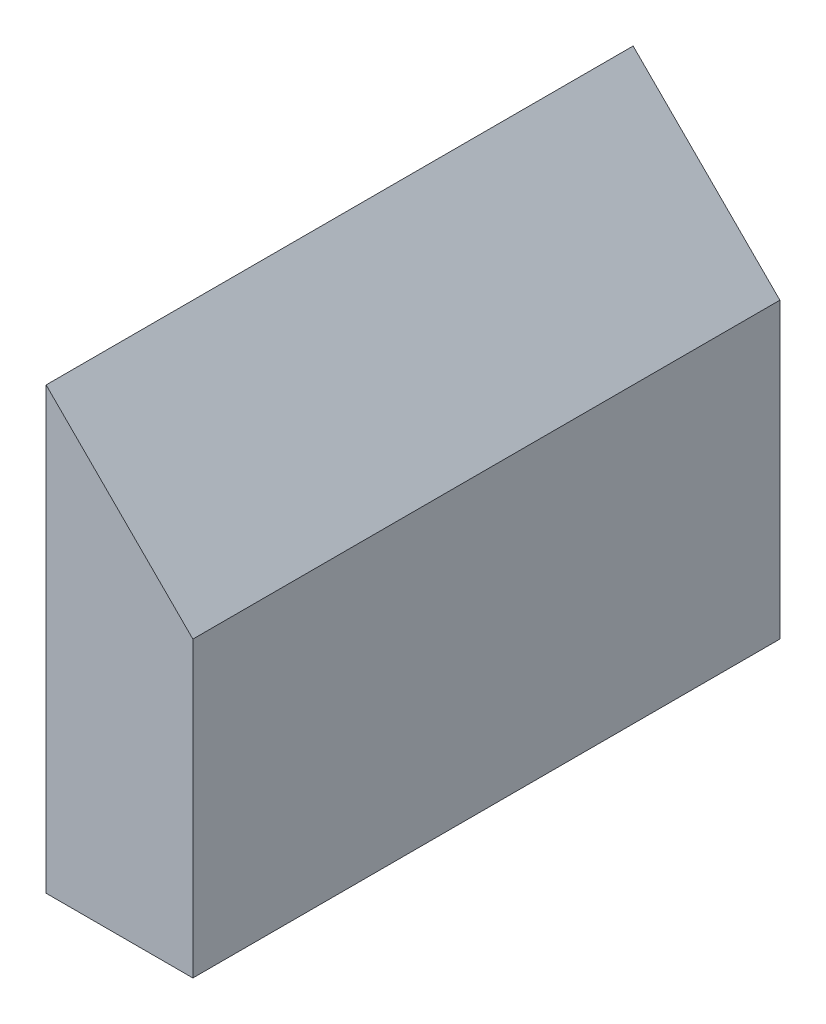
ISO-10303-21;
HEADER;
FILE_DESCRIPTION(('STEP AP214'),'2;1');
FILE_NAME('part.step','',(''),(''),'','','');
FILE_SCHEMA(('AUTOMOTIVE_DESIGN { 1 0 10303 214 1 1 1 1 }'));
ENDSEC;
DATA;
#1=APPLICATION_CONTEXT('core data for automotive mechanical design processes');
#2=APPLICATION_PROTOCOL_DEFINITION('international standard','automotive_design',2000,#1);
#3=PRODUCT_CONTEXT('',#1,'mechanical');
#4=PRODUCT('Part','Part','',(#3));
#5=PRODUCT_RELATED_PRODUCT_CATEGORY('part','',(#4));
#6=PRODUCT_DEFINITION_FORMATION('','',#4);
#7=PRODUCT_DEFINITION_CONTEXT('part definition',#1,'design');
#8=PRODUCT_DEFINITION('design','',#6,#7);
#9=PRODUCT_DEFINITION_SHAPE('','',#8);
#10=(LENGTH_UNIT() NAMED_UNIT(*) SI_UNIT(.MILLI.,.METRE.));
#11=(NAMED_UNIT(*) PLANE_ANGLE_UNIT() SI_UNIT($,.RADIAN.));
#12=(NAMED_UNIT(*) SI_UNIT($,.STERADIAN.) SOLID_ANGLE_UNIT());
#13=UNCERTAINTY_MEASURE_WITH_UNIT(LENGTH_MEASURE(1.E-05),#10,'distance_accuracy_value','');
#14=(GEOMETRIC_REPRESENTATION_CONTEXT(3) GLOBAL_UNCERTAINTY_ASSIGNED_CONTEXT((#13)) GLOBAL_UNIT_ASSIGNED_CONTEXT((#10,
#11,#12)) REPRESENTATION_CONTEXT('',''));
#15=CARTESIAN_POINT('',(0.,0.,0.));
#16=DIRECTION('',(0.,0.,1.));
#17=DIRECTION('',(1.,0.,0.));
#18=AXIS2_PLACEMENT_3D('',#15,#16,#17);
#19=CARTESIAN_POINT('',(0.,0.,40.));
#20=DIRECTION('',(-1.,0.,0.));
#21=DIRECTION('',(0.,0.,1.));
#22=AXIS2_PLACEMENT_3D('',#19,#20,#21);
#23=PLANE('',#22);
#24=DIRECTION('',(0.,1.,0.));
#25=VECTOR('',#24,1.);
#26=CARTESIAN_POINT('',(0.,0.,0.));
#27=LINE('',#26,#25);
#28=CARTESIAN_POINT('',(0.,0.,0.));
#29=VERTEX_POINT('',#28);
#30=CARTESIAN_POINT('',(0.,30.,0.));
#31=VERTEX_POINT('',#30);
#32=EDGE_CURVE('E104',#29,#31,#27,.T.);
#33=ORIENTED_EDGE('',*,*,#32,.F.);
#34=DIRECTION('',(0.,0.,-1.));
#35=VECTOR('',#34,1.);
#36=CARTESIAN_POINT('',(0.,0.,40.));
#37=LINE('',#36,#35);
#38=CARTESIAN_POINT('',(0.,0.,40.));
#39=VERTEX_POINT('',#38);
#40=EDGE_CURVE('E11',#39,#29,#37,.T.);
#41=ORIENTED_EDGE('',*,*,#40,.F.);
#42=DIRECTION('',(0.,1.,0.));
#43=VECTOR('',#42,1.);
#44=CARTESIAN_POINT('',(0.,0.,40.));
#45=LINE('',#44,#43);
#46=CARTESIAN_POINT('',(0.,30.,40.));
#47=VERTEX_POINT('',#46);
#48=EDGE_CURVE('E100',#39,#47,#45,.T.);
#49=ORIENTED_EDGE('',*,*,#48,.T.);
#50=DIRECTION('',(0.,0.,-1.));
#51=VECTOR('',#50,1.);
#52=CARTESIAN_POINT('',(0.,30.,40.));
#53=LINE('',#52,#51);
#54=EDGE_CURVE('E45',#47,#31,#53,.T.);
#55=ORIENTED_EDGE('',*,*,#54,.T.);
#56=EDGE_LOOP('',(#33,#41,#49,#55));
#57=FACE_BOUND('',#56,.T.);
#58=ADVANCED_FACE('F39',(#57),#23,.T.);
#59=CARTESIAN_POINT('',(10.,0.,40.));
#60=DIRECTION('',(0.,-1.,0.));
#61=DIRECTION('',(1.,0.,0.));
#62=AXIS2_PLACEMENT_3D('',#59,#60,#61);
#63=PLANE('',#62);
#64=DIRECTION('',(-1.,0.,0.));
#65=VECTOR('',#64,1.);
#66=CARTESIAN_POINT('',(10.,0.,0.));
#67=LINE('',#66,#65);
#68=CARTESIAN_POINT('',(10.,0.,0.));
#69=VERTEX_POINT('',#68);
#70=EDGE_CURVE('E98',#69,#29,#67,.T.);
#71=ORIENTED_EDGE('',*,*,#70,.F.);
#72=DIRECTION('',(0.,0.,-1.));
#73=VECTOR('',#72,1.);
#74=CARTESIAN_POINT('',(10.,0.,40.));
#75=LINE('',#74,#73);
#76=CARTESIAN_POINT('',(10.,0.,40.));
#77=VERTEX_POINT('',#76);
#78=EDGE_CURVE('E48',#77,#69,#75,.T.);
#79=ORIENTED_EDGE('',*,*,#78,.F.);
#80=DIRECTION('',(-1.,0.,0.));
#81=VECTOR('',#80,1.);
#82=CARTESIAN_POINT('',(10.,0.,40.));
#83=LINE('',#82,#81);
#84=EDGE_CURVE('E92',#77,#39,#83,.T.);
#85=ORIENTED_EDGE('',*,*,#84,.T.);
#86=ORIENTED_EDGE('',*,*,#40,.T.);
#87=EDGE_LOOP('',(#71,#79,#85,#86));
#88=FACE_BOUND('',#87,.T.);
#89=ADVANCED_FACE('F111',(#88),#63,.T.);
#90=CARTESIAN_POINT('',(10.,20.,40.));
#91=DIRECTION('',(1.,0.,0.));
#92=DIRECTION('',(0.,1.,0.));
#93=AXIS2_PLACEMENT_3D('',#90,#91,#92);
#94=PLANE('',#93);
#95=DIRECTION('',(0.,-1.,0.));
#96=VECTOR('',#95,1.);
#97=CARTESIAN_POINT('',(10.,20.,0.));
#98=LINE('',#97,#96);
#99=CARTESIAN_POINT('',(10.,20.,0.));
#100=VERTEX_POINT('',#99);
#101=EDGE_CURVE('E87',#100,#69,#98,.T.);
#102=ORIENTED_EDGE('',*,*,#101,.F.);
#103=DIRECTION('',(0.,0.,-1.));
#104=VECTOR('',#103,1.);
#105=CARTESIAN_POINT('',(10.,20.,40.));
#106=LINE('',#105,#104);
#107=CARTESIAN_POINT('',(10.,20.,40.));
#108=VERTEX_POINT('',#107);
#109=EDGE_CURVE('E84',#108,#100,#106,.T.);
#110=ORIENTED_EDGE('',*,*,#109,.F.);
#111=DIRECTION('',(0.,-1.,0.));
#112=VECTOR('',#111,1.);
#113=CARTESIAN_POINT('',(10.,20.,40.));
#114=LINE('',#113,#112);
#115=EDGE_CURVE('E90',#108,#77,#114,.T.);
#116=ORIENTED_EDGE('',*,*,#115,.T.);
#117=ORIENTED_EDGE('',*,*,#78,.T.);
#118=EDGE_LOOP('',(#102,#110,#116,#117));
#119=FACE_BOUND('',#118,.T.);
#120=ADVANCED_FACE('F86',(#119),#94,.T.);
#121=CARTESIAN_POINT('',(0.,30.,40.));
#122=DIRECTION('',(0.707106781186547,0.707106781186548,0.));
#123=DIRECTION('',(-0.707106781186548,0.707106781186547,0.));
#124=AXIS2_PLACEMENT_3D('',#121,#122,#123);
#125=PLANE('',#124);
#126=DIRECTION('',(0.707106781186548,-0.707106781186547,0.));
#127=VECTOR('',#126,1.);
#128=CARTESIAN_POINT('',(0.,30.,0.));
#129=LINE('',#128,#127);
#130=EDGE_CURVE('E106',#31,#100,#129,.T.);
#131=ORIENTED_EDGE('',*,*,#130,.F.);
#132=ORIENTED_EDGE('',*,*,#54,.F.);
#133=DIRECTION('',(0.707106781186548,-0.707106781186547,0.));
#134=VECTOR('',#133,1.);
#135=CARTESIAN_POINT('',(0.,30.,40.));
#136=LINE('',#135,#134);
#137=EDGE_CURVE('E93',#47,#108,#136,.T.);
#138=ORIENTED_EDGE('',*,*,#137,.T.);
#139=ORIENTED_EDGE('',*,*,#109,.T.);
#140=EDGE_LOOP('',(#131,#132,#138,#139));
#141=FACE_BOUND('',#140,.T.);
#142=ADVANCED_FACE('F96',(#141),#125,.T.);
#143=CARTESIAN_POINT('',(0.,0.,40.));
#144=DIRECTION('',(0.,0.,1.));
#145=DIRECTION('',(1.,0.,0.));
#146=AXIS2_PLACEMENT_3D('',#143,#144,#145);
#147=PLANE('',#146);
#148=ORIENTED_EDGE('',*,*,#48,.F.);
#149=ORIENTED_EDGE('',*,*,#84,.F.);
#150=ORIENTED_EDGE('',*,*,#115,.F.);
#151=ORIENTED_EDGE('',*,*,#137,.F.);
#152=EDGE_LOOP('',(#148,#149,#150,#151));
#153=FACE_BOUND('',#152,.T.);
#154=ADVANCED_FACE('F95',(#153),#147,.T.);
#155=CARTESIAN_POINT('',(0.,0.,0.));
#156=DIRECTION('',(0.,0.,1.));
#157=DIRECTION('',(1.,0.,0.));
#158=AXIS2_PLACEMENT_3D('',#155,#156,#157);
#159=PLANE('',#158);
#160=ORIENTED_EDGE('',*,*,#32,.T.);
#161=ORIENTED_EDGE('',*,*,#130,.T.);
#162=ORIENTED_EDGE('',*,*,#101,.T.);
#163=ORIENTED_EDGE('',*,*,#70,.T.);
#164=EDGE_LOOP('',(#160,#161,#162,#163));
#165=FACE_BOUND('',#164,.T.);
#166=ADVANCED_FACE('F115',(#165),#159,.F.);
#167=CLOSED_SHELL('',(#58,#89,#120,#142,#154,#166));
#168=MANIFOLD_SOLID_BREP('B2',#167);
#169=ADVANCED_BREP_SHAPE_REPRESENTATION('',(#18,#168),#14);
#170=SHAPE_DEFINITION_REPRESENTATION(#9,#169);
ENDSEC;
END-ISO-10303-21;
